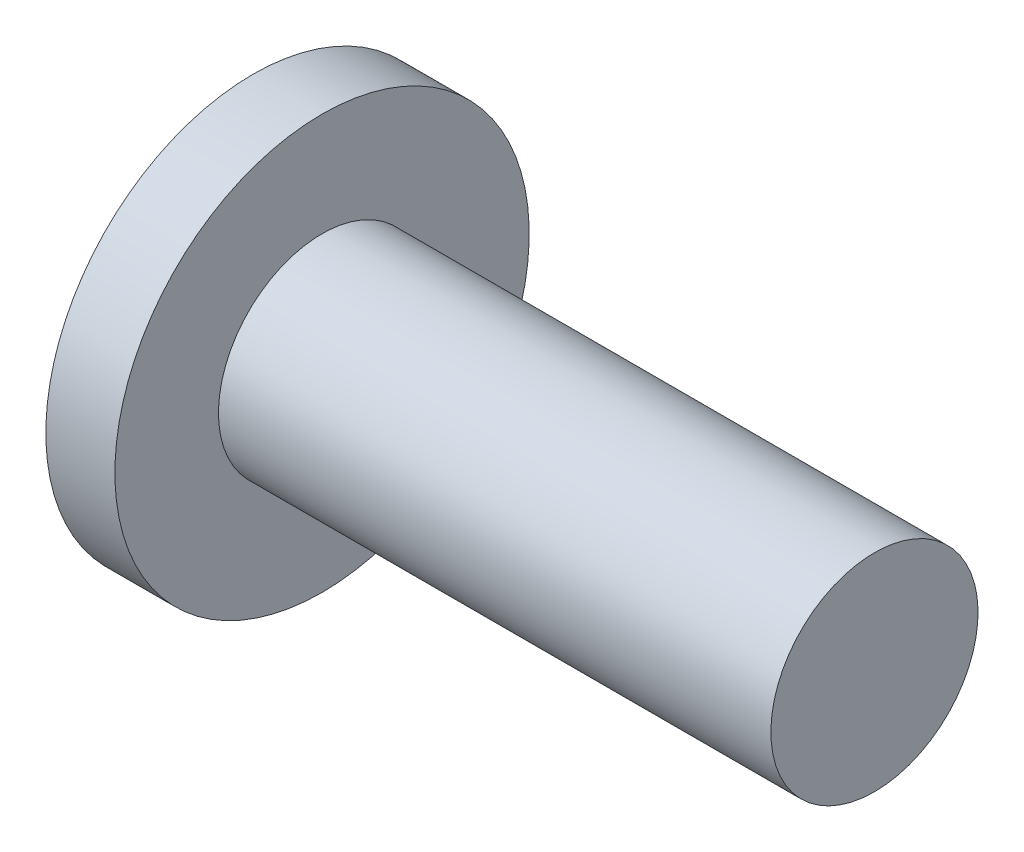
ISO-10303-21;
HEADER;
FILE_DESCRIPTION(('STEP AP214'),'2;1');
FILE_NAME('part.step','',(''),(''),'','','');
FILE_SCHEMA(('AUTOMOTIVE_DESIGN { 1 0 10303 214 1 1 1 1 }'));
ENDSEC;
DATA;
#1=APPLICATION_CONTEXT('core data for automotive mechanical design processes');
#2=APPLICATION_PROTOCOL_DEFINITION('international standard','automotive_design',2000,#1);
#3=PRODUCT_CONTEXT('',#1,'mechanical');
#4=PRODUCT('Part','Part','',(#3));
#5=PRODUCT_RELATED_PRODUCT_CATEGORY('part','',(#4));
#6=PRODUCT_DEFINITION_FORMATION('','',#4);
#7=PRODUCT_DEFINITION_CONTEXT('part definition',#1,'design');
#8=PRODUCT_DEFINITION('design','',#6,#7);
#9=PRODUCT_DEFINITION_SHAPE('','',#8);
#10=(LENGTH_UNIT() NAMED_UNIT(*) SI_UNIT(.MILLI.,.METRE.));
#11=(NAMED_UNIT(*) PLANE_ANGLE_UNIT() SI_UNIT($,.RADIAN.));
#12=(NAMED_UNIT(*) SI_UNIT($,.STERADIAN.) SOLID_ANGLE_UNIT());
#13=UNCERTAINTY_MEASURE_WITH_UNIT(LENGTH_MEASURE(1.E-05),#10,'distance_accuracy_value','');
#14=(GEOMETRIC_REPRESENTATION_CONTEXT(3) GLOBAL_UNCERTAINTY_ASSIGNED_CONTEXT((#13)) GLOBAL_UNIT_ASSIGNED_CONTEXT((#10,
#11,#12)) REPRESENTATION_CONTEXT('',''));
#15=CARTESIAN_POINT('',(0.,0.,0.));
#16=DIRECTION('',(0.,0.,1.));
#17=DIRECTION('',(1.,0.,0.));
#18=AXIS2_PLACEMENT_3D('',#15,#16,#17);
#19=CARTESIAN_POINT('',(0.,0.,0.));
#20=DIRECTION('',(-1.,0.,0.));
#21=DIRECTION('',(0.,-1.,0.));
#22=AXIS2_PLACEMENT_3D('',#19,#20,#21);
#23=PLANE('',#22);
#24=CARTESIAN_POINT('',(0.,-1.5,0.));
#25=DIRECTION('',(-1.,0.,0.));
#26=DIRECTION('',(0.,-1.,0.));
#27=AXIS2_PLACEMENT_3D('',#24,#25,#26);
#28=CIRCLE('',#27,3.);
#29=CARTESIAN_POINT('',(0.,-4.5,0.));
#30=VERTEX_POINT('',#29);
#31=EDGE_CURVE('E10',#30,#30,#28,.T.);
#32=ORIENTED_EDGE('',*,*,#31,.F.);
#33=EDGE_LOOP('',(#32));
#34=FACE_BOUND('',#33,.T.);
#35=CARTESIAN_POINT('',(0.,-1.5,0.));
#36=DIRECTION('',(-1.,0.,0.));
#37=DIRECTION('',(0.,-1.,0.));
#38=AXIS2_PLACEMENT_3D('',#35,#36,#37);
#39=CIRCLE('',#38,1.5);
#40=CARTESIAN_POINT('',(0.,-3.,0.));
#41=VERTEX_POINT('',#40);
#42=EDGE_CURVE('E51',#41,#41,#39,.T.);
#43=ORIENTED_EDGE('',*,*,#42,.T.);
#44=EDGE_LOOP('',(#43));
#45=FACE_BOUND('',#44,.T.);
#46=ADVANCED_FACE('F37',(#34,#45),#23,.F.);
#47=CARTESIAN_POINT('',(-1.,-1.5,0.));
#48=DIRECTION('',(-1.,0.,0.));
#49=DIRECTION('',(0.,-1.,0.));
#50=AXIS2_PLACEMENT_3D('',#47,#48,#49);
#51=CYLINDRICAL_SURFACE('',#50,3.);
#52=CARTESIAN_POINT('',(-1.,-1.5,0.));
#53=DIRECTION('',(-1.,0.,0.));
#54=DIRECTION('',(0.,-1.,0.));
#55=AXIS2_PLACEMENT_3D('',#52,#53,#54);
#56=CIRCLE('',#55,3.);
#57=CARTESIAN_POINT('',(-0.999999999999999,-4.5,0.));
#58=VERTEX_POINT('',#57);
#59=EDGE_CURVE('E43',#58,#58,#56,.T.);
#60=ORIENTED_EDGE('',*,*,#59,.F.);
#61=EDGE_LOOP('',(#60));
#62=FACE_BOUND('',#61,.T.);
#63=ORIENTED_EDGE('',*,*,#31,.T.);
#64=EDGE_LOOP('',(#63));
#65=FACE_BOUND('',#64,.T.);
#66=ADVANCED_FACE('F71',(#62,#65),#51,.T.);
#67=CARTESIAN_POINT('',(-1.,1.5,0.));
#68=DIRECTION('',(1.,0.,0.));
#69=DIRECTION('',(0.,1.,0.));
#70=AXIS2_PLACEMENT_3D('',#67,#68,#69);
#71=PLANE('',#70);
#72=ORIENTED_EDGE('',*,*,#59,.T.);
#73=EDGE_LOOP('',(#72));
#74=FACE_BOUND('',#73,.T.);
#75=ADVANCED_FACE('F66',(#74),#71,.F.);
#76=CARTESIAN_POINT('',(8.,0.,0.));
#77=DIRECTION('',(-1.,0.,0.));
#78=DIRECTION('',(0.,-1.,0.));
#79=AXIS2_PLACEMENT_3D('',#76,#77,#78);
#80=PLANE('',#79);
#81=CARTESIAN_POINT('',(8.,-1.5,0.));
#82=DIRECTION('',(-1.,0.,0.));
#83=DIRECTION('',(0.,-1.,0.));
#84=AXIS2_PLACEMENT_3D('',#81,#82,#83);
#85=CIRCLE('',#84,1.5);
#86=CARTESIAN_POINT('',(8.,-3.,0.));
#87=VERTEX_POINT('',#86);
#88=EDGE_CURVE('E47',#87,#87,#85,.T.);
#89=ORIENTED_EDGE('',*,*,#88,.F.);
#90=EDGE_LOOP('',(#89));
#91=FACE_BOUND('',#90,.T.);
#92=ADVANCED_FACE('F61',(#91),#80,.F.);
#93=CARTESIAN_POINT('',(-1.,-1.5,0.));
#94=DIRECTION('',(-1.,0.,0.));
#95=DIRECTION('',(0.,-1.,0.));
#96=AXIS2_PLACEMENT_3D('',#93,#94,#95);
#97=CYLINDRICAL_SURFACE('',#96,1.5);
#98=ORIENTED_EDGE('',*,*,#42,.F.);
#99=EDGE_LOOP('',(#98));
#100=FACE_BOUND('',#99,.T.);
#101=ORIENTED_EDGE('',*,*,#88,.T.);
#102=EDGE_LOOP('',(#101));
#103=FACE_BOUND('',#102,.T.);
#104=ADVANCED_FACE('F58',(#100,#103),#97,.T.);
#105=CLOSED_SHELL('',(#46,#66,#75,#92,#104));
#106=MANIFOLD_SOLID_BREP('B2',#105);
#107=ADVANCED_BREP_SHAPE_REPRESENTATION('',(#18,#106),#14);
#108=SHAPE_DEFINITION_REPRESENTATION(#9,#107);
ENDSEC;
END-ISO-10303-21;
